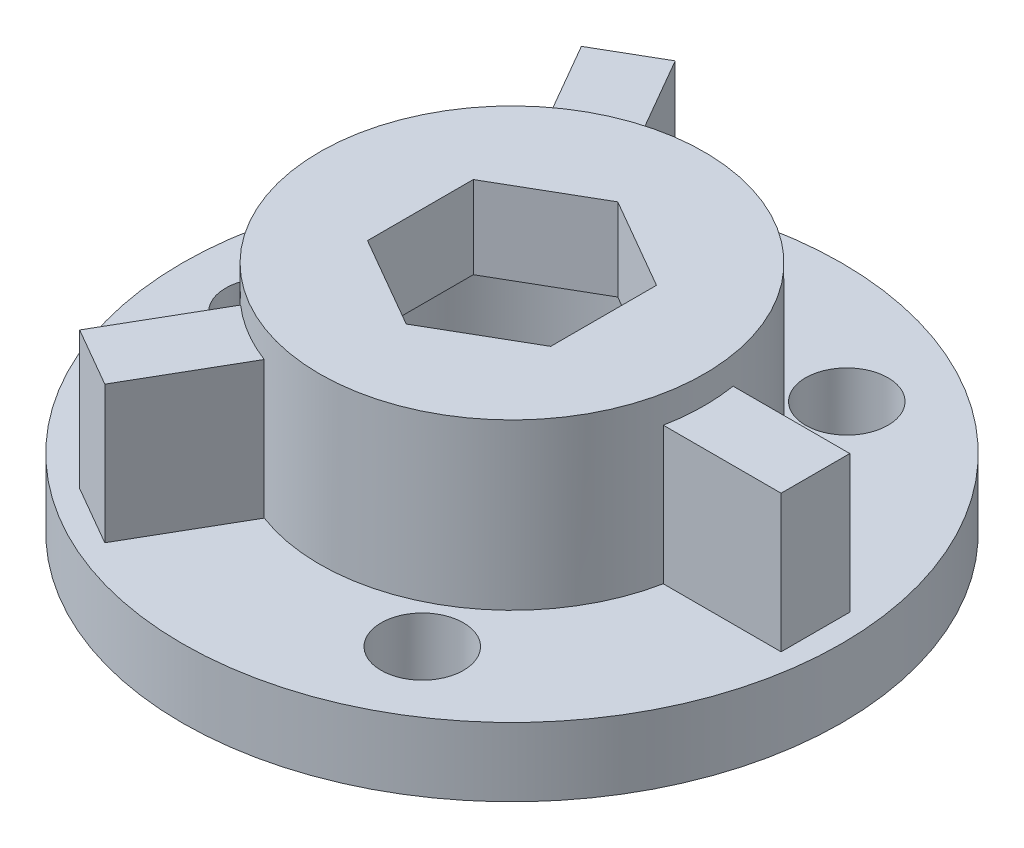
ISO-10303-21;
HEADER;
FILE_DESCRIPTION(('STEP AP214'),'2;1');
FILE_NAME('part.step','',(''),(''),'','','');
FILE_SCHEMA(('AUTOMOTIVE_DESIGN { 1 0 10303 214 1 1 1 1 }'));
ENDSEC;
DATA;
#1=APPLICATION_CONTEXT('core data for automotive mechanical design processes');
#2=APPLICATION_PROTOCOL_DEFINITION('international standard','automotive_design',2000,#1);
#3=PRODUCT_CONTEXT('',#1,'mechanical');
#4=PRODUCT('Part','Part','',(#3));
#5=PRODUCT_RELATED_PRODUCT_CATEGORY('part','',(#4));
#6=PRODUCT_DEFINITION_FORMATION('','',#4);
#7=PRODUCT_DEFINITION_CONTEXT('part definition',#1,'design');
#8=PRODUCT_DEFINITION('design','',#6,#7);
#9=PRODUCT_DEFINITION_SHAPE('','',#8);
#10=(LENGTH_UNIT() NAMED_UNIT(*) SI_UNIT(.MILLI.,.METRE.));
#11=(NAMED_UNIT(*) PLANE_ANGLE_UNIT() SI_UNIT($,.RADIAN.));
#12=(NAMED_UNIT(*) SI_UNIT($,.STERADIAN.) SOLID_ANGLE_UNIT());
#13=UNCERTAINTY_MEASURE_WITH_UNIT(LENGTH_MEASURE(1.E-05),#10,'distance_accuracy_value','');
#14=(GEOMETRIC_REPRESENTATION_CONTEXT(3) GLOBAL_UNCERTAINTY_ASSIGNED_CONTEXT((#13)) GLOBAL_UNIT_ASSIGNED_CONTEXT((#10,
#11,#12)) REPRESENTATION_CONTEXT('',''));
#15=CARTESIAN_POINT('',(0.,0.,0.));
#16=DIRECTION('',(0.,0.,1.));
#17=DIRECTION('',(1.,0.,0.));
#18=AXIS2_PLACEMENT_3D('',#15,#16,#17);
#19=CARTESIAN_POINT('',(0.,2.5,0.));
#20=DIRECTION('',(0.,1.,0.));
#21=DIRECTION('',(0.,0.,1.));
#22=AXIS2_PLACEMENT_3D('',#19,#20,#21);
#23=PLANE('',#22);
#24=CARTESIAN_POINT('',(-8.92,2.5,0.));
#25=DIRECTION('',(0.,1.,0.));
#26=DIRECTION('',(0.,0.,1.));
#27=AXIS2_PLACEMENT_3D('',#24,#25,#26);
#28=CIRCLE('',#27,1.5);
#29=CARTESIAN_POINT('',(-8.92,2.5,1.4999999999999));
#30=VERTEX_POINT('',#29);
#31=EDGE_CURVE('E233',#30,#30,#28,.T.);
#32=ORIENTED_EDGE('',*,*,#31,.F.);
#33=EDGE_LOOP('',(#32));
#34=FACE_BOUND('',#33,.T.);
#35=CARTESIAN_POINT('',(4.45999999999995,2.5,7.72494660175722));
#36=DIRECTION('',(0.,1.,0.));
#37=DIRECTION('',(0.,0.,1.));
#38=AXIS2_PLACEMENT_3D('',#35,#36,#37);
#39=CIRCLE('',#38,1.5);
#40=CARTESIAN_POINT('',(4.45999999999995,2.5,9.22494660175722));
#41=VERTEX_POINT('',#40);
#42=EDGE_CURVE('E239',#41,#41,#39,.T.);
#43=ORIENTED_EDGE('',*,*,#42,.F.);
#44=EDGE_LOOP('',(#43));
#45=FACE_BOUND('',#44,.T.);
#46=CARTESIAN_POINT('',(4.46000000000001,2.5,-7.72494660175719));
#47=DIRECTION('',(0.,1.,0.));
#48=DIRECTION('',(0.,0.,1.));
#49=AXIS2_PLACEMENT_3D('',#46,#47,#48);
#50=CIRCLE('',#49,1.5);
#51=CARTESIAN_POINT('',(4.46000000000001,2.5,-6.22494660175719));
#52=VERTEX_POINT('',#51);
#53=EDGE_CURVE('E245',#52,#52,#50,.T.);
#54=ORIENTED_EDGE('',*,*,#53,.F.);
#55=EDGE_LOOP('',(#54));
#56=FACE_BOUND('',#55,.T.);
#57=CARTESIAN_POINT('',(0.,2.5,0.));
#58=DIRECTION('',(0.,1.,0.));
#59=DIRECTION('',(0.,0.,1.));
#60=AXIS2_PLACEMENT_3D('',#57,#58,#59);
#61=CIRCLE('',#60,12.);
#62=CARTESIAN_POINT('',(0.,2.5,12.));
#63=VERTEX_POINT('',#62);
#64=EDGE_CURVE('E303',#63,#63,#61,.T.);
#65=ORIENTED_EDGE('',*,*,#64,.T.);
#66=EDGE_LOOP('',(#65));
#67=FACE_BOUND('',#66,.T.);
#68=DIRECTION('',(-0.866025403784443,0.,0.499999999999992));
#69=VECTOR('',#68,1.);
#70=CARTESIAN_POINT('',(-6.56442429049857,2.5,-9.09036340646633));
#71=LINE('',#70,#69);
#72=CARTESIAN_POINT('',(-4.39936078103746,2.5,-10.3403634064663));
#73=VERTEX_POINT('',#72);
#74=CARTESIAN_POINT('',(-6.56442429049856,2.5,-9.09036340646633));
#75=VERTEX_POINT('',#74);
#76=EDGE_CURVE('E49',#73,#75,#71,.T.);
#77=ORIENTED_EDGE('',*,*,#76,.F.);
#78=DIRECTION('',(-0.499999999999992,0.,-0.866025403784443));
#79=VECTOR('',#78,1.);
#80=CARTESIAN_POINT('',(-4.39936078103746,2.5,-10.3403634064663));
#81=LINE('',#80,#79);
#82=CARTESIAN_POINT('',(-2.25529719616014,2.5,-6.62673634280044));
#83=VERTEX_POINT('',#82);
#84=EDGE_CURVE('E171',#83,#73,#81,.T.);
#85=ORIENTED_EDGE('',*,*,#84,.F.);
#86=CARTESIAN_POINT('',(0.,2.5,0.));
#87=DIRECTION('',(0.,1.,0.));
#88=DIRECTION('',(0.,0.,1.));
#89=AXIS2_PLACEMENT_3D('',#86,#87,#88);
#90=CIRCLE('',#89,7.);
#91=CARTESIAN_POINT('',(6.90658450644976,2.5,-1.13977649355834));
#92=VERTEX_POINT('',#91);
#93=EDGE_CURVE('E296',#92,#83,#90,.T.);
#94=ORIENTED_EDGE('',*,*,#93,.F.);
#95=DIRECTION('',(-1.,0.,0.));
#96=VECTOR('',#95,1.);
#97=CARTESIAN_POINT('',(11.1546977848816,2.5,-1.13977649355834));
#98=LINE('',#97,#96);
#99=CARTESIAN_POINT('',(11.1546977848816,2.5,-1.13977649355834));
#100=VERTEX_POINT('',#99);
#101=EDGE_CURVE('E212',#100,#92,#98,.T.);
#102=ORIENTED_EDGE('',*,*,#101,.F.);
#103=DIRECTION('',(0.,0.,-1.));
#104=VECTOR('',#103,1.);
#105=CARTESIAN_POINT('',(11.1546977848816,2.5,-1.13977649355834));
#106=LINE('',#105,#104);
#107=CARTESIAN_POINT('',(11.1546977848816,2.5,1.36022350644166));
#108=VERTEX_POINT('',#107);
#109=EDGE_CURVE('E220',#108,#100,#106,.T.);
#110=ORIENTED_EDGE('',*,*,#109,.F.);
#111=DIRECTION('',(1.,0.,0.));
#112=VECTOR('',#111,1.);
#113=CARTESIAN_POINT('',(11.1546977848816,2.5,1.36022350644166));
#114=LINE('',#113,#112);
#115=CARTESIAN_POINT('',(6.86657061512685,2.5,1.36022350644166));
#116=VERTEX_POINT('',#115);
#117=EDGE_CURVE('E208',#116,#108,#114,.T.);
#118=ORIENTED_EDGE('',*,*,#117,.F.);
#119=CARTESIAN_POINT('',(-2.46621685516704,2.5,6.55116588274866));
#120=VERTEX_POINT('',#119);
#121=EDGE_CURVE('E282',#120,#116,#90,.T.);
#122=ORIENTED_EDGE('',*,*,#121,.F.);
#123=DIRECTION('',(0.500000000000004,0.,-0.866025403784436));
#124=VECTOR('',#123,1.);
#125=CARTESIAN_POINT('',(-4.59027349438296,2.5,10.2301399000246));
#126=LINE('',#125,#124);
#127=CARTESIAN_POINT('',(-4.59027349438295,2.5,10.2301399000246));
#128=VERTEX_POINT('',#127);
#129=EDGE_CURVE('E190',#128,#120,#126,.T.);
#130=ORIENTED_EDGE('',*,*,#129,.F.);
#131=DIRECTION('',(0.866025403784436,0.,0.500000000000004));
#132=VECTOR('',#131,1.);
#133=CARTESIAN_POINT('',(-4.59027349438296,2.5,10.2301399000246));
#134=LINE('',#133,#132);
#135=CARTESIAN_POINT('',(-6.75533700384405,2.5,8.98013990002457));
#136=VERTEX_POINT('',#135);
#137=EDGE_CURVE('E198',#136,#128,#134,.T.);
#138=ORIENTED_EDGE('',*,*,#137,.F.);
#139=DIRECTION('',(-0.500000000000004,0.,0.866025403784437));
#140=VECTOR('',#139,1.);
#141=CARTESIAN_POINT('',(-6.75533700384405,2.5,8.98013990002457));
#142=LINE('',#141,#140);
#143=CARTESIAN_POINT('',(-4.61127341896668,2.5,5.26651283635874));
#144=VERTEX_POINT('',#143);
#145=EDGE_CURVE('E173',#144,#136,#142,.T.);
#146=ORIENTED_EDGE('',*,*,#145,.F.);
#147=CARTESIAN_POINT('',(-4.4403676512827,2.5,-5.41138938919037));
#148=VERTEX_POINT('',#147);
#149=EDGE_CURVE('E299',#148,#144,#90,.T.);
#150=ORIENTED_EDGE('',*,*,#149,.F.);
#151=DIRECTION('',(0.499999999999992,0.,0.866025403784443));
#152=VECTOR('',#151,1.);
#153=CARTESIAN_POINT('',(-6.56442429049857,2.5,-9.09036340646633));
#154=LINE('',#153,#152);
#155=EDGE_CURVE('E54',#75,#148,#154,.T.);
#156=ORIENTED_EDGE('',*,*,#155,.F.);
#157=EDGE_LOOP('',(#77,#85,#94,#102,#110,#118,#122,#130,#138,#146,#150,#156));
#158=FACE_BOUND('',#157,.T.);
#159=ADVANCED_FACE('F34',(#34,#45,#56,#67,#158),#23,.T.);
#160=CARTESIAN_POINT('',(0.,8.5,0.));
#161=DIRECTION('',(0.,-1.,0.));
#162=DIRECTION('',(0.,0.,-1.));
#163=AXIS2_PLACEMENT_3D('',#160,#161,#162);
#164=CYLINDRICAL_SURFACE('',#163,7.);
#165=CARTESIAN_POINT('',(0.,8.5,0.));
#166=DIRECTION('',(0.,1.,0.));
#167=DIRECTION('',(0.,0.,1.));
#168=AXIS2_PLACEMENT_3D('',#165,#166,#167);
#169=CIRCLE('',#168,7.);
#170=CARTESIAN_POINT('',(0.,8.5,7.));
#171=VERTEX_POINT('',#170);
#172=EDGE_CURVE('E292',#171,#171,#169,.T.);
#173=ORIENTED_EDGE('',*,*,#172,.F.);
#174=EDGE_LOOP('',(#173));
#175=FACE_BOUND('',#174,.T.);
#176=DIRECTION('',(0.,-1.,0.));
#177=VECTOR('',#176,1.);
#178=CARTESIAN_POINT('',(-2.25529719616014,8.5,-6.62673634280045));
#179=LINE('',#178,#177);
#180=CARTESIAN_POINT('',(-2.25529719616014,7.5,-6.62673634280044));
#181=VERTEX_POINT('',#180);
#182=EDGE_CURVE('E11',#181,#83,#179,.T.);
#183=ORIENTED_EDGE('',*,*,#182,.F.);
#184=CARTESIAN_POINT('',(0.,7.5,0.));
#185=DIRECTION('',(0.,-1.,0.));
#186=DIRECTION('',(0.,0.,-1.));
#187=AXIS2_PLACEMENT_3D('',#184,#185,#186);
#188=CIRCLE('',#187,7.);
#189=CARTESIAN_POINT('',(-4.4403676512827,7.5,-5.41138938919037));
#190=VERTEX_POINT('',#189);
#191=EDGE_CURVE('E165',#190,#181,#188,.T.);
#192=ORIENTED_EDGE('',*,*,#191,.F.);
#193=DIRECTION('',(0.,-1.,0.));
#194=VECTOR('',#193,1.);
#195=CARTESIAN_POINT('',(-4.4403676512827,8.5,-5.41138938919037));
#196=LINE('',#195,#194);
#197=EDGE_CURVE('E42',#148,#190,#196,.F.);
#198=ORIENTED_EDGE('',*,*,#197,.F.);
#199=ORIENTED_EDGE('',*,*,#149,.T.);
#200=DIRECTION('',(0.,-1.,0.));
#201=VECTOR('',#200,1.);
#202=CARTESIAN_POINT('',(-4.61127341896668,8.5,5.26651283635874));
#203=LINE('',#202,#201);
#204=CARTESIAN_POINT('',(-4.61127341896668,7.5,5.26651283635874));
#205=VERTEX_POINT('',#204);
#206=EDGE_CURVE('E325',#205,#144,#203,.T.);
#207=ORIENTED_EDGE('',*,*,#206,.F.);
#208=CARTESIAN_POINT('',(0.,7.5,0.));
#209=DIRECTION('',(0.,-1.,0.));
#210=DIRECTION('',(0.,0.,-1.));
#211=AXIS2_PLACEMENT_3D('',#208,#209,#210);
#212=CIRCLE('',#211,7.);
#213=CARTESIAN_POINT('',(-2.46621685516704,7.5,6.55116588274866));
#214=VERTEX_POINT('',#213);
#215=EDGE_CURVE('E319',#214,#205,#212,.T.);
#216=ORIENTED_EDGE('',*,*,#215,.F.);
#217=DIRECTION('',(0.,-1.,0.));
#218=VECTOR('',#217,1.);
#219=CARTESIAN_POINT('',(-2.46621685516704,8.5,6.55116588274866));
#220=LINE('',#219,#218);
#221=EDGE_CURVE('E322',#120,#214,#220,.F.);
#222=ORIENTED_EDGE('',*,*,#221,.F.);
#223=ORIENTED_EDGE('',*,*,#121,.T.);
#224=DIRECTION('',(0.,-1.,0.));
#225=VECTOR('',#224,1.);
#226=CARTESIAN_POINT('',(6.86657061512685,8.5,1.36022350644166));
#227=LINE('',#226,#225);
#228=CARTESIAN_POINT('',(6.86657061512685,7.5,1.36022350644166));
#229=VERTEX_POINT('',#228);
#230=EDGE_CURVE('E316',#229,#116,#227,.T.);
#231=ORIENTED_EDGE('',*,*,#230,.F.);
#232=CARTESIAN_POINT('',(0.,7.5,0.));
#233=DIRECTION('',(0.,-1.,0.));
#234=DIRECTION('',(0.,0.,-1.));
#235=AXIS2_PLACEMENT_3D('',#232,#233,#234);
#236=CIRCLE('',#235,7.);
#237=CARTESIAN_POINT('',(6.90658450644976,7.5,-1.13977649355834));
#238=VERTEX_POINT('',#237);
#239=EDGE_CURVE('E310',#238,#229,#236,.T.);
#240=ORIENTED_EDGE('',*,*,#239,.F.);
#241=DIRECTION('',(0.,-1.,0.));
#242=VECTOR('',#241,1.);
#243=CARTESIAN_POINT('',(6.90658450644976,8.5,-1.13977649355834));
#244=LINE('',#243,#242);
#245=EDGE_CURVE('E313',#92,#238,#244,.F.);
#246=ORIENTED_EDGE('',*,*,#245,.F.);
#247=ORIENTED_EDGE('',*,*,#93,.T.);
#248=EDGE_LOOP('',(#183,#192,#198,#199,#207,#216,#222,#223,#231,#240,#246,#247));
#249=FACE_BOUND('',#248,.T.);
#250=ADVANCED_FACE('F332',(#175,#249),#164,.T.);
#251=CARTESIAN_POINT('',(0.,0.,3.85));
#252=DIRECTION('',(0.499999999999995,0.,0.866025403784442));
#253=DIRECTION('',(0.866025403784441,0.,-0.499999999999995));
#254=AXIS2_PLACEMENT_3D('',#251,#252,#253);
#255=PLANE('',#254);
#256=DIRECTION('',(0.866025403784441,0.,-0.499999999999995));
#257=VECTOR('',#256,1.);
#258=CARTESIAN_POINT('',(0.,5.5,3.85));
#259=LINE('',#258,#257);
#260=CARTESIAN_POINT('',(0.,5.5,3.85));
#261=VERTEX_POINT('',#260);
#262=CARTESIAN_POINT('',(3.33419780457008,5.5,1.92500000000001));
#263=VERTEX_POINT('',#262);
#264=EDGE_CURVE('E259',#261,#263,#259,.T.);
#265=ORIENTED_EDGE('',*,*,#264,.F.);
#266=DIRECTION('',(0.,1.,0.));
#267=VECTOR('',#266,1.);
#268=CARTESIAN_POINT('',(0.,0.,3.85));
#269=LINE('',#268,#267);
#270=CARTESIAN_POINT('',(0.,8.5,3.85));
#271=VERTEX_POINT('',#270);
#272=EDGE_CURVE('E280',#261,#271,#269,.T.);
#273=ORIENTED_EDGE('',*,*,#272,.T.);
#274=DIRECTION('',(0.866025403784441,0.,-0.499999999999995));
#275=VECTOR('',#274,1.);
#276=CARTESIAN_POINT('',(0.,8.5,3.85));
#277=LINE('',#276,#275);
#278=CARTESIAN_POINT('',(3.33419780457008,8.5,1.92500000000001));
#279=VERTEX_POINT('',#278);
#280=EDGE_CURVE('E261',#271,#279,#277,.T.);
#281=ORIENTED_EDGE('',*,*,#280,.T.);
#282=DIRECTION('',(0.,1.,0.));
#283=VECTOR('',#282,1.);
#284=CARTESIAN_POINT('',(3.33419780457008,0.,1.92500000000001));
#285=LINE('',#284,#283);
#286=EDGE_CURVE('E279',#263,#279,#285,.T.);
#287=ORIENTED_EDGE('',*,*,#286,.F.);
#288=EDGE_LOOP('',(#265,#273,#281,#287));
#289=FACE_BOUND('',#288,.T.);
#290=ADVANCED_FACE('F369',(#289),#255,.F.);
#291=CARTESIAN_POINT('',(-3.33419780457011,0.,1.92499999999996));
#292=DIRECTION('',(-0.500000000000009,0.,0.866025403784434));
#293=DIRECTION('',(0.866025403784433,0.,0.500000000000009));
#294=AXIS2_PLACEMENT_3D('',#291,#292,#293);
#295=PLANE('',#294);
#296=DIRECTION('',(0.866025403784433,0.,0.500000000000009));
#297=VECTOR('',#296,1.);
#298=CARTESIAN_POINT('',(-3.33419780457011,5.5,1.92499999999996));
#299=LINE('',#298,#297);
#300=CARTESIAN_POINT('',(-3.33419780457011,5.5,1.92499999999996));
#301=VERTEX_POINT('',#300);
#302=EDGE_CURVE('E257',#301,#261,#299,.T.);
#303=ORIENTED_EDGE('',*,*,#302,.F.);
#304=DIRECTION('',(0.,1.,0.));
#305=VECTOR('',#304,1.);
#306=CARTESIAN_POINT('',(-3.33419780457011,0.,1.92499999999996));
#307=LINE('',#306,#305);
#308=CARTESIAN_POINT('',(-3.33419780457011,8.5,1.92499999999996));
#309=VERTEX_POINT('',#308);
#310=EDGE_CURVE('E283',#301,#309,#307,.T.);
#311=ORIENTED_EDGE('',*,*,#310,.T.);
#312=DIRECTION('',(0.866025403784433,0.,0.500000000000009));
#313=VECTOR('',#312,1.);
#314=CARTESIAN_POINT('',(-3.33419780457011,8.5,1.92499999999996));
#315=LINE('',#314,#313);
#316=EDGE_CURVE('E276',#309,#271,#315,.T.);
#317=ORIENTED_EDGE('',*,*,#316,.T.);
#318=ORIENTED_EDGE('',*,*,#272,.F.);
#319=EDGE_LOOP('',(#303,#311,#317,#318));
#320=FACE_BOUND('',#319,.T.);
#321=ADVANCED_FACE('F434',(#320),#295,.F.);
#322=CARTESIAN_POINT('',(-3.33419780457007,0.,-1.92500000000003));
#323=DIRECTION('',(-1.,0.,0.));
#324=DIRECTION('',(0.,0.,1.));
#325=AXIS2_PLACEMENT_3D('',#322,#323,#324);
#326=PLANE('',#325);
#327=DIRECTION('',(0.,0.,1.));
#328=VECTOR('',#327,1.);
#329=CARTESIAN_POINT('',(-3.33419780457007,5.5,-1.92500000000003));
#330=LINE('',#329,#328);
#331=CARTESIAN_POINT('',(-3.33419780457007,5.5,-1.92500000000003));
#332=VERTEX_POINT('',#331);
#333=EDGE_CURVE('E255',#332,#301,#330,.T.);
#334=ORIENTED_EDGE('',*,*,#333,.F.);
#335=DIRECTION('',(0.,1.,0.));
#336=VECTOR('',#335,1.);
#337=CARTESIAN_POINT('',(-3.33419780457007,0.,-1.92500000000003));
#338=LINE('',#337,#336);
#339=CARTESIAN_POINT('',(-3.33419780457007,8.5,-1.92500000000003));
#340=VERTEX_POINT('',#339);
#341=EDGE_CURVE('E285',#332,#340,#338,.T.);
#342=ORIENTED_EDGE('',*,*,#341,.T.);
#343=DIRECTION('',(0.,0.,1.));
#344=VECTOR('',#343,1.);
#345=CARTESIAN_POINT('',(-3.33419780457007,8.5,-1.92500000000003));
#346=LINE('',#345,#344);
#347=EDGE_CURVE('E273',#340,#309,#346,.T.);
#348=ORIENTED_EDGE('',*,*,#347,.T.);
#349=ORIENTED_EDGE('',*,*,#310,.F.);
#350=EDGE_LOOP('',(#334,#342,#348,#349));
#351=FACE_BOUND('',#350,.T.);
#352=ADVANCED_FACE('F431',(#351),#326,.F.);
#353=CARTESIAN_POINT('',(-3.33419780457007,0.,-1.92500000000003));
#354=DIRECTION('',(-0.499999999999994,0.,-0.866025403784442));
#355=DIRECTION('',(-0.866025403784442,0.,0.499999999999994));
#356=AXIS2_PLACEMENT_3D('',#353,#354,#355);
#357=PLANE('',#356);
#358=DIRECTION('',(-0.866025403784442,0.,0.499999999999994));
#359=VECTOR('',#358,1.);
#360=CARTESIAN_POINT('',(-3.33419780457007,5.5,-1.92500000000003));
#361=LINE('',#360,#359);
#362=CARTESIAN_POINT('',(0.,5.5,-3.85));
#363=VERTEX_POINT('',#362);
#364=EDGE_CURVE('E253',#363,#332,#361,.T.);
#365=ORIENTED_EDGE('',*,*,#364,.F.);
#366=DIRECTION('',(0.,1.,0.));
#367=VECTOR('',#366,1.);
#368=CARTESIAN_POINT('',(0.,0.,-3.85));
#369=LINE('',#368,#367);
#370=CARTESIAN_POINT('',(0.,8.5,-3.85));
#371=VERTEX_POINT('',#370);
#372=EDGE_CURVE('E287',#363,#371,#369,.T.);
#373=ORIENTED_EDGE('',*,*,#372,.T.);
#374=DIRECTION('',(-0.866025403784442,0.,0.499999999999994));
#375=VECTOR('',#374,1.);
#376=CARTESIAN_POINT('',(-3.33419780457007,8.5,-1.92500000000003));
#377=LINE('',#376,#375);
#378=EDGE_CURVE('E270',#371,#340,#377,.T.);
#379=ORIENTED_EDGE('',*,*,#378,.T.);
#380=ORIENTED_EDGE('',*,*,#341,.F.);
#381=EDGE_LOOP('',(#365,#373,#379,#380));
#382=FACE_BOUND('',#381,.T.);
#383=ADVANCED_FACE('F429',(#382),#357,.F.);
#384=CARTESIAN_POINT('',(0.,0.,-3.85));
#385=DIRECTION('',(0.500000000000011,0.,-0.866025403784433));
#386=DIRECTION('',(-0.866025403784432,0.,-0.500000000000011));
#387=AXIS2_PLACEMENT_3D('',#384,#385,#386);
#388=PLANE('',#387);
#389=DIRECTION('',(-0.866025403784432,0.,-0.500000000000011));
#390=VECTOR('',#389,1.);
#391=CARTESIAN_POINT('',(0.,5.5,-3.85));
#392=LINE('',#391,#390);
#393=CARTESIAN_POINT('',(3.33419780457002,5.5,-1.92499999999999));
#394=VERTEX_POINT('',#393);
#395=EDGE_CURVE('E251',#394,#363,#392,.T.);
#396=ORIENTED_EDGE('',*,*,#395,.F.);
#397=DIRECTION('',(0.,1.,0.));
#398=VECTOR('',#397,1.);
#399=CARTESIAN_POINT('',(3.33419780457002,0.,-1.92499999999999));
#400=LINE('',#399,#398);
#401=CARTESIAN_POINT('',(3.33419780457002,8.5,-1.92499999999999));
#402=VERTEX_POINT('',#401);
#403=EDGE_CURVE('E289',#394,#402,#400,.T.);
#404=ORIENTED_EDGE('',*,*,#403,.T.);
#405=DIRECTION('',(-0.866025403784432,0.,-0.500000000000011));
#406=VECTOR('',#405,1.);
#407=CARTESIAN_POINT('',(0.,8.5,-3.85));
#408=LINE('',#407,#406);
#409=EDGE_CURVE('E267',#402,#371,#408,.T.);
#410=ORIENTED_EDGE('',*,*,#409,.T.);
#411=ORIENTED_EDGE('',*,*,#372,.F.);
#412=EDGE_LOOP('',(#396,#404,#410,#411));
#413=FACE_BOUND('',#412,.T.);
#414=ADVANCED_FACE('F424',(#413),#388,.F.);
#415=CARTESIAN_POINT('',(3.33419780457008,0.,1.92500000000001));
#416=DIRECTION('',(1.,0.,0.));
#417=DIRECTION('',(0.,0.,-1.));
#418=AXIS2_PLACEMENT_3D('',#415,#416,#417);
#419=PLANE('',#418);
#420=DIRECTION('',(0.,0.,-1.));
#421=VECTOR('',#420,1.);
#422=CARTESIAN_POINT('',(3.33419780457008,5.5,1.92500000000001));
#423=LINE('',#422,#421);
#424=EDGE_CURVE('E306',#263,#394,#423,.T.);
#425=ORIENTED_EDGE('',*,*,#424,.F.);
#426=ORIENTED_EDGE('',*,*,#286,.T.);
#427=DIRECTION('',(0.,0.,-1.));
#428=VECTOR('',#427,1.);
#429=CARTESIAN_POINT('',(3.33419780457008,8.5,1.92500000000001));
#430=LINE('',#429,#428);
#431=EDGE_CURVE('E264',#279,#402,#430,.T.);
#432=ORIENTED_EDGE('',*,*,#431,.T.);
#433=ORIENTED_EDGE('',*,*,#403,.F.);
#434=EDGE_LOOP('',(#425,#426,#432,#433));
#435=FACE_BOUND('',#434,.T.);
#436=ADVANCED_FACE('F385',(#435),#419,.F.);
#437=CARTESIAN_POINT('',(0.,2.5,0.));
#438=DIRECTION('',(0.,-1.,0.));
#439=DIRECTION('',(0.,0.,-1.));
#440=AXIS2_PLACEMENT_3D('',#437,#438,#439);
#441=CYLINDRICAL_SURFACE('',#440,12.);
#442=ORIENTED_EDGE('',*,*,#64,.F.);
#443=EDGE_LOOP('',(#442));
#444=FACE_BOUND('',#443,.T.);
#445=CARTESIAN_POINT('',(0.,0.,0.));
#446=DIRECTION('',(0.,1.,0.));
#447=DIRECTION('',(0.,0.,1.));
#448=AXIS2_PLACEMENT_3D('',#445,#446,#447);
#449=CIRCLE('',#448,12.);
#450=CARTESIAN_POINT('',(0.,0.,12.));
#451=VERTEX_POINT('',#450);
#452=EDGE_CURVE('E302',#451,#451,#449,.T.);
#453=ORIENTED_EDGE('',*,*,#452,.T.);
#454=EDGE_LOOP('',(#453));
#455=FACE_BOUND('',#454,.T.);
#456=ADVANCED_FACE('F36',(#444,#455),#441,.T.);
#457=CARTESIAN_POINT('',(0.,0.,0.));
#458=DIRECTION('',(0.,1.,0.));
#459=DIRECTION('',(0.,0.,1.));
#460=AXIS2_PLACEMENT_3D('',#457,#458,#459);
#461=PLANE('',#460);
#462=CARTESIAN_POINT('',(-8.92,0.,0.));
#463=DIRECTION('',(0.,-1.,0.));
#464=DIRECTION('',(-0.866025403784443,0.,0.499999999999992));
#465=AXIS2_PLACEMENT_3D('',#462,#463,#464);
#466=CIRCLE('',#465,1.5);
#467=CARTESIAN_POINT('',(-10.2190381056767,0.,0.749999999999892));
#468=VERTEX_POINT('',#467);
#469=EDGE_CURVE('E230',#468,#468,#466,.T.);
#470=ORIENTED_EDGE('',*,*,#469,.F.);
#471=EDGE_LOOP('',(#470));
#472=FACE_BOUND('',#471,.T.);
#473=CARTESIAN_POINT('',(4.45999999999995,0.,7.72494660175722));
#474=DIRECTION('',(0.,-1.,0.));
#475=DIRECTION('',(0.866025403784436,0.,0.500000000000004));
#476=AXIS2_PLACEMENT_3D('',#473,#474,#475);
#477=CIRCLE('',#476,1.5);
#478=CARTESIAN_POINT('',(5.75903810567661,0.,8.47494660175723));
#479=VERTEX_POINT('',#478);
#480=EDGE_CURVE('E236',#479,#479,#477,.T.);
#481=ORIENTED_EDGE('',*,*,#480,.F.);
#482=EDGE_LOOP('',(#481));
#483=FACE_BOUND('',#482,.T.);
#484=CARTESIAN_POINT('',(4.46000000000001,0.,-7.72494660175719));
#485=DIRECTION('',(0.,-1.,0.));
#486=DIRECTION('',(0.,0.,-1.));
#487=AXIS2_PLACEMENT_3D('',#484,#485,#486);
#488=CIRCLE('',#487,1.5);
#489=CARTESIAN_POINT('',(4.46000000000001,0.,-9.22494660175719));
#490=VERTEX_POINT('',#489);
#491=EDGE_CURVE('E242',#490,#490,#488,.T.);
#492=ORIENTED_EDGE('',*,*,#491,.F.);
#493=EDGE_LOOP('',(#492));
#494=FACE_BOUND('',#493,.T.);
#495=CARTESIAN_POINT('',(0.,0.,0.));
#496=DIRECTION('',(0.,1.,0.));
#497=DIRECTION('',(0.,0.,1.));
#498=AXIS2_PLACEMENT_3D('',#495,#496,#497);
#499=CIRCLE('',#498,5.7);
#500=CARTESIAN_POINT('',(0.,0.,5.7));
#501=VERTEX_POINT('',#500);
#502=EDGE_CURVE('E295',#501,#501,#499,.T.);
#503=ORIENTED_EDGE('',*,*,#502,.T.);
#504=EDGE_LOOP('',(#503));
#505=FACE_BOUND('',#504,.T.);
#506=ORIENTED_EDGE('',*,*,#452,.F.);
#507=EDGE_LOOP('',(#506));
#508=FACE_BOUND('',#507,.T.);
#509=ADVANCED_FACE('F376',(#472,#483,#494,#505,#508),#461,.F.);
#510=CARTESIAN_POINT('',(0.,0.,0.));
#511=DIRECTION('',(0.,1.,0.));
#512=DIRECTION('',(0.,0.,1.));
#513=AXIS2_PLACEMENT_3D('',#510,#511,#512);
#514=CYLINDRICAL_SURFACE('',#513,5.7);
#515=ORIENTED_EDGE('',*,*,#502,.F.);
#516=EDGE_LOOP('',(#515));
#517=FACE_BOUND('',#516,.T.);
#518=CARTESIAN_POINT('',(0.,5.5,0.));
#519=DIRECTION('',(0.,-1.,0.));
#520=DIRECTION('',(0.,0.,-1.));
#521=AXIS2_PLACEMENT_3D('',#518,#519,#520);
#522=CIRCLE('',#521,5.7);
#523=CARTESIAN_POINT('',(0.,5.5,-5.7));
#524=VERTEX_POINT('',#523);
#525=EDGE_CURVE('E248',#524,#524,#522,.T.);
#526=ORIENTED_EDGE('',*,*,#525,.F.);
#527=EDGE_LOOP('',(#526));
#528=FACE_BOUND('',#527,.T.);
#529=ADVANCED_FACE('F375',(#517,#528),#514,.F.);
#530=CARTESIAN_POINT('',(0.,8.5,0.));
#531=DIRECTION('',(0.,1.,0.));
#532=DIRECTION('',(0.,0.,1.));
#533=AXIS2_PLACEMENT_3D('',#530,#531,#532);
#534=PLANE('',#533);
#535=ORIENTED_EDGE('',*,*,#280,.F.);
#536=ORIENTED_EDGE('',*,*,#316,.F.);
#537=ORIENTED_EDGE('',*,*,#347,.F.);
#538=ORIENTED_EDGE('',*,*,#378,.F.);
#539=ORIENTED_EDGE('',*,*,#409,.F.);
#540=ORIENTED_EDGE('',*,*,#431,.F.);
#541=EDGE_LOOP('',(#535,#536,#537,#538,#539,#540));
#542=FACE_BOUND('',#541,.T.);
#543=ORIENTED_EDGE('',*,*,#172,.T.);
#544=EDGE_LOOP('',(#543));
#545=FACE_BOUND('',#544,.T.);
#546=ADVANCED_FACE('F383',(#542,#545),#534,.T.);
#547=CARTESIAN_POINT('',(0.,5.5,0.));
#548=DIRECTION('',(0.,-1.,0.));
#549=DIRECTION('',(0.,0.,-1.));
#550=AXIS2_PLACEMENT_3D('',#547,#548,#549);
#551=PLANE('',#550);
#552=ORIENTED_EDGE('',*,*,#525,.T.);
#553=EDGE_LOOP('',(#552));
#554=FACE_BOUND('',#553,.T.);
#555=ORIENTED_EDGE('',*,*,#264,.T.);
#556=ORIENTED_EDGE('',*,*,#424,.T.);
#557=ORIENTED_EDGE('',*,*,#395,.T.);
#558=ORIENTED_EDGE('',*,*,#364,.T.);
#559=ORIENTED_EDGE('',*,*,#333,.T.);
#560=ORIENTED_EDGE('',*,*,#302,.T.);
#561=EDGE_LOOP('',(#555,#556,#557,#558,#559,#560));
#562=FACE_BOUND('',#561,.T.);
#563=ADVANCED_FACE('F400',(#554,#562),#551,.T.);
#564=CARTESIAN_POINT('',(4.46000000000001,8.5,-7.72494660175719));
#565=DIRECTION('',(0.,-1.,0.));
#566=DIRECTION('',(0.,0.,-1.));
#567=AXIS2_PLACEMENT_3D('',#564,#565,#566);
#568=CYLINDRICAL_SURFACE('',#567,1.5);
#569=ORIENTED_EDGE('',*,*,#53,.T.);
#570=EDGE_LOOP('',(#569));
#571=FACE_BOUND('',#570,.T.);
#572=ORIENTED_EDGE('',*,*,#491,.T.);
#573=EDGE_LOOP('',(#572));
#574=FACE_BOUND('',#573,.T.);
#575=ADVANCED_FACE('F403',(#571,#574),#568,.F.);
#576=CARTESIAN_POINT('',(4.45999999999995,8.5,7.72494660175722));
#577=DIRECTION('',(0.,-1.,0.));
#578=DIRECTION('',(0.,0.,-1.));
#579=AXIS2_PLACEMENT_3D('',#576,#577,#578);
#580=CYLINDRICAL_SURFACE('',#579,1.5);
#581=ORIENTED_EDGE('',*,*,#42,.T.);
#582=EDGE_LOOP('',(#581));
#583=FACE_BOUND('',#582,.T.);
#584=ORIENTED_EDGE('',*,*,#480,.T.);
#585=EDGE_LOOP('',(#584));
#586=FACE_BOUND('',#585,.T.);
#587=ADVANCED_FACE('F468',(#583,#586),#580,.F.);
#588=CARTESIAN_POINT('',(-8.92,8.5,0.));
#589=DIRECTION('',(0.,-1.,0.));
#590=DIRECTION('',(0.,0.,-1.));
#591=AXIS2_PLACEMENT_3D('',#588,#589,#590);
#592=CYLINDRICAL_SURFACE('',#591,1.5);
#593=ORIENTED_EDGE('',*,*,#31,.T.);
#594=EDGE_LOOP('',(#593));
#595=FACE_BOUND('',#594,.T.);
#596=ORIENTED_EDGE('',*,*,#469,.T.);
#597=EDGE_LOOP('',(#596));
#598=FACE_BOUND('',#597,.T.);
#599=ADVANCED_FACE('F475',(#595,#598),#592,.F.);
#600=CARTESIAN_POINT('',(11.1546977848816,7.5,1.36022350644166));
#601=DIRECTION('',(0.,0.,-1.));
#602=DIRECTION('',(-1.,0.,0.));
#603=AXIS2_PLACEMENT_3D('',#600,#601,#602);
#604=PLANE('',#603);
#605=DIRECTION('',(1.,0.,0.));
#606=VECTOR('',#605,1.);
#607=CARTESIAN_POINT('',(11.1546977848816,7.5,1.36022350644166));
#608=LINE('',#607,#606);
#609=CARTESIAN_POINT('',(11.1546977848816,7.5,1.36022350644166));
#610=VERTEX_POINT('',#609);
#611=EDGE_CURVE('E209',#229,#610,#608,.T.);
#612=ORIENTED_EDGE('',*,*,#611,.F.);
#613=ORIENTED_EDGE('',*,*,#230,.T.);
#614=ORIENTED_EDGE('',*,*,#117,.T.);
#615=DIRECTION('',(0.,-1.,0.));
#616=VECTOR('',#615,1.);
#617=CARTESIAN_POINT('',(11.1546977848816,7.5,1.36022350644166));
#618=LINE('',#617,#616);
#619=EDGE_CURVE('E227',#610,#108,#618,.T.);
#620=ORIENTED_EDGE('',*,*,#619,.F.);
#621=EDGE_LOOP('',(#612,#613,#614,#620));
#622=FACE_BOUND('',#621,.T.);
#623=ADVANCED_FACE('F339',(#622),#604,.F.);
#624=CARTESIAN_POINT('',(11.1546977848816,7.5,-1.13977649355834));
#625=DIRECTION('',(0.,0.,1.));
#626=DIRECTION('',(1.,0.,0.));
#627=AXIS2_PLACEMENT_3D('',#624,#625,#626);
#628=PLANE('',#627);
#629=ORIENTED_EDGE('',*,*,#101,.T.);
#630=ORIENTED_EDGE('',*,*,#245,.T.);
#631=DIRECTION('',(-1.,0.,0.));
#632=VECTOR('',#631,1.);
#633=CARTESIAN_POINT('',(11.1546977848816,7.5,-1.13977649355834));
#634=LINE('',#633,#632);
#635=CARTESIAN_POINT('',(11.1546977848816,7.5,-1.13977649355834));
#636=VERTEX_POINT('',#635);
#637=EDGE_CURVE('E214',#636,#238,#634,.T.);
#638=ORIENTED_EDGE('',*,*,#637,.F.);
#639=DIRECTION('',(0.,-1.,0.));
#640=VECTOR('',#639,1.);
#641=CARTESIAN_POINT('',(11.1546977848816,7.5,-1.13977649355834));
#642=LINE('',#641,#640);
#643=EDGE_CURVE('E217',#636,#100,#642,.T.);
#644=ORIENTED_EDGE('',*,*,#643,.T.);
#645=EDGE_LOOP('',(#629,#630,#638,#644));
#646=FACE_BOUND('',#645,.T.);
#647=ADVANCED_FACE('F347',(#646),#628,.F.);
#648=CARTESIAN_POINT('',(0.,7.5,0.));
#649=DIRECTION('',(0.,-1.,0.));
#650=DIRECTION('',(0.,0.,-1.));
#651=AXIS2_PLACEMENT_3D('',#648,#649,#650);
#652=PLANE('',#651);
#653=ORIENTED_EDGE('',*,*,#637,.T.);
#654=ORIENTED_EDGE('',*,*,#239,.T.);
#655=ORIENTED_EDGE('',*,*,#611,.T.);
#656=DIRECTION('',(0.,0.,-1.));
#657=VECTOR('',#656,1.);
#658=CARTESIAN_POINT('',(11.1546977848816,7.5,-1.13977649355834));
#659=LINE('',#658,#657);
#660=EDGE_CURVE('E211',#610,#636,#659,.T.);
#661=ORIENTED_EDGE('',*,*,#660,.T.);
#662=EDGE_LOOP('',(#653,#654,#655,#661));
#663=FACE_BOUND('',#662,.T.);
#664=ADVANCED_FACE('F342',(#663),#652,.F.);
#665=CARTESIAN_POINT('',(11.1546977848816,7.5,-1.13977649355834));
#666=DIRECTION('',(-1.,0.,0.));
#667=DIRECTION('',(0.,0.,1.));
#668=AXIS2_PLACEMENT_3D('',#665,#666,#667);
#669=PLANE('',#668);
#670=ORIENTED_EDGE('',*,*,#109,.T.);
#671=ORIENTED_EDGE('',*,*,#643,.F.);
#672=ORIENTED_EDGE('',*,*,#660,.F.);
#673=ORIENTED_EDGE('',*,*,#619,.T.);
#674=EDGE_LOOP('',(#670,#671,#672,#673));
#675=FACE_BOUND('',#674,.T.);
#676=ADVANCED_FACE('F349',(#675),#669,.F.);
#677=CARTESIAN_POINT('',(-6.75533700384405,7.5,8.98013990002457));
#678=DIRECTION('',(0.866025403784436,0.,0.500000000000004));
#679=DIRECTION('',(0.500000000000004,0.,-0.866025403784436));
#680=AXIS2_PLACEMENT_3D('',#677,#678,#679);
#681=PLANE('',#680);
#682=DIRECTION('',(-0.500000000000004,0.,0.866025403784437));
#683=VECTOR('',#682,1.);
#684=CARTESIAN_POINT('',(-6.75533700384405,7.5,8.98013990002457));
#685=LINE('',#684,#683);
#686=CARTESIAN_POINT('',(-6.75533700384405,7.5,8.98013990002457));
#687=VERTEX_POINT('',#686);
#688=EDGE_CURVE('E187',#205,#687,#685,.T.);
#689=ORIENTED_EDGE('',*,*,#688,.F.);
#690=ORIENTED_EDGE('',*,*,#206,.T.);
#691=ORIENTED_EDGE('',*,*,#145,.T.);
#692=DIRECTION('',(0.,-1.,0.));
#693=VECTOR('',#692,1.);
#694=CARTESIAN_POINT('',(-6.75533700384405,7.5,8.98013990002457));
#695=LINE('',#694,#693);
#696=EDGE_CURVE('E205',#687,#136,#695,.T.);
#697=ORIENTED_EDGE('',*,*,#696,.F.);
#698=EDGE_LOOP('',(#689,#690,#691,#697));
#699=FACE_BOUND('',#698,.T.);
#700=ADVANCED_FACE('F351',(#699),#681,.F.);
#701=CARTESIAN_POINT('',(-4.59027349438296,7.5,10.2301399000246));
#702=DIRECTION('',(-0.866025403784436,0.,-0.500000000000004));
#703=DIRECTION('',(-0.500000000000004,0.,0.866025403784436));
#704=AXIS2_PLACEMENT_3D('',#701,#702,#703);
#705=PLANE('',#704);
#706=ORIENTED_EDGE('',*,*,#129,.T.);
#707=ORIENTED_EDGE('',*,*,#221,.T.);
#708=DIRECTION('',(0.500000000000004,0.,-0.866025403784436));
#709=VECTOR('',#708,1.);
#710=CARTESIAN_POINT('',(-4.59027349438296,7.5,10.2301399000246));
#711=LINE('',#710,#709);
#712=CARTESIAN_POINT('',(-4.59027349438296,7.5,10.2301399000246));
#713=VERTEX_POINT('',#712);
#714=EDGE_CURVE('E192',#713,#214,#711,.T.);
#715=ORIENTED_EDGE('',*,*,#714,.F.);
#716=DIRECTION('',(0.,-1.,0.));
#717=VECTOR('',#716,1.);
#718=CARTESIAN_POINT('',(-4.59027349438296,7.5,10.2301399000246));
#719=LINE('',#718,#717);
#720=EDGE_CURVE('E195',#713,#128,#719,.T.);
#721=ORIENTED_EDGE('',*,*,#720,.T.);
#722=EDGE_LOOP('',(#706,#707,#715,#721));
#723=FACE_BOUND('',#722,.T.);
#724=ADVANCED_FACE('F357',(#723),#705,.F.);
#725=CARTESIAN_POINT('',(0.,7.5,0.));
#726=DIRECTION('',(0.,-1.,0.));
#727=DIRECTION('',(0.866025403784436,0.,0.500000000000004));
#728=AXIS2_PLACEMENT_3D('',#725,#726,#727);
#729=PLANE('',#728);
#730=ORIENTED_EDGE('',*,*,#714,.T.);
#731=ORIENTED_EDGE('',*,*,#215,.T.);
#732=ORIENTED_EDGE('',*,*,#688,.T.);
#733=DIRECTION('',(0.866025403784436,0.,0.500000000000004));
#734=VECTOR('',#733,1.);
#735=CARTESIAN_POINT('',(-4.59027349438296,7.5,10.2301399000246));
#736=LINE('',#735,#734);
#737=EDGE_CURVE('E189',#687,#713,#736,.T.);
#738=ORIENTED_EDGE('',*,*,#737,.T.);
#739=EDGE_LOOP('',(#730,#731,#732,#738));
#740=FACE_BOUND('',#739,.T.);
#741=ADVANCED_FACE('F527',(#740),#729,.F.);
#742=CARTESIAN_POINT('',(-4.59027349438296,7.5,10.2301399000246));
#743=DIRECTION('',(0.500000000000004,0.,-0.866025403784436));
#744=DIRECTION('',(-0.866025403784436,0.,-0.500000000000004));
#745=AXIS2_PLACEMENT_3D('',#742,#743,#744);
#746=PLANE('',#745);
#747=ORIENTED_EDGE('',*,*,#137,.T.);
#748=ORIENTED_EDGE('',*,*,#720,.F.);
#749=ORIENTED_EDGE('',*,*,#737,.F.);
#750=ORIENTED_EDGE('',*,*,#696,.T.);
#751=EDGE_LOOP('',(#747,#748,#749,#750));
#752=FACE_BOUND('',#751,.T.);
#753=ADVANCED_FACE('F537',(#752),#746,.F.);
#754=CARTESIAN_POINT('',(-4.39936078103746,7.5,-10.3403634064663));
#755=DIRECTION('',(-0.866025403784443,0.,0.499999999999992));
#756=DIRECTION('',(0.499999999999992,0.,0.866025403784443));
#757=AXIS2_PLACEMENT_3D('',#754,#755,#756);
#758=PLANE('',#757);
#759=DIRECTION('',(-0.499999999999992,0.,-0.866025403784443));
#760=VECTOR('',#759,1.);
#761=CARTESIAN_POINT('',(-4.39936078103746,7.5,-10.3403634064663));
#762=LINE('',#761,#760);
#763=CARTESIAN_POINT('',(-4.39936078103746,7.5,-10.3403634064663));
#764=VERTEX_POINT('',#763);
#765=EDGE_CURVE('E158',#181,#764,#762,.T.);
#766=ORIENTED_EDGE('',*,*,#765,.F.);
#767=ORIENTED_EDGE('',*,*,#182,.T.);
#768=ORIENTED_EDGE('',*,*,#84,.T.);
#769=DIRECTION('',(0.,-1.,0.));
#770=VECTOR('',#769,1.);
#771=CARTESIAN_POINT('',(-4.39936078103746,7.5,-10.3403634064663));
#772=LINE('',#771,#770);
#773=EDGE_CURVE('E169',#764,#73,#772,.T.);
#774=ORIENTED_EDGE('',*,*,#773,.F.);
#775=EDGE_LOOP('',(#766,#767,#768,#774));
#776=FACE_BOUND('',#775,.T.);
#777=ADVANCED_FACE('F170',(#776),#758,.F.);
#778=CARTESIAN_POINT('',(-6.56442429049857,7.5,-9.09036340646633));
#779=DIRECTION('',(0.866025403784443,0.,-0.499999999999992));
#780=DIRECTION('',(-0.499999999999992,0.,-0.866025403784443));
#781=AXIS2_PLACEMENT_3D('',#778,#779,#780);
#782=PLANE('',#781);
#783=ORIENTED_EDGE('',*,*,#155,.T.);
#784=ORIENTED_EDGE('',*,*,#197,.T.);
#785=DIRECTION('',(0.499999999999992,0.,0.866025403784443));
#786=VECTOR('',#785,1.);
#787=CARTESIAN_POINT('',(-6.56442429049857,7.5,-9.09036340646633));
#788=LINE('',#787,#786);
#789=CARTESIAN_POINT('',(-6.56442429049857,7.5,-9.09036340646633));
#790=VERTEX_POINT('',#789);
#791=EDGE_CURVE('E179',#790,#190,#788,.T.);
#792=ORIENTED_EDGE('',*,*,#791,.F.);
#793=DIRECTION('',(0.,-1.,0.));
#794=VECTOR('',#793,1.);
#795=CARTESIAN_POINT('',(-6.56442429049857,7.5,-9.09036340646633));
#796=LINE('',#795,#794);
#797=EDGE_CURVE('E174',#790,#75,#796,.T.);
#798=ORIENTED_EDGE('',*,*,#797,.T.);
#799=EDGE_LOOP('',(#783,#784,#792,#798));
#800=FACE_BOUND('',#799,.T.);
#801=ADVANCED_FACE('F330',(#800),#782,.F.);
#802=CARTESIAN_POINT('',(0.,7.5,0.));
#803=DIRECTION('',(0.,-1.,0.));
#804=DIRECTION('',(-0.866025403784443,0.,0.499999999999992));
#805=AXIS2_PLACEMENT_3D('',#802,#803,#804);
#806=PLANE('',#805);
#807=ORIENTED_EDGE('',*,*,#791,.T.);
#808=ORIENTED_EDGE('',*,*,#191,.T.);
#809=ORIENTED_EDGE('',*,*,#765,.T.);
#810=DIRECTION('',(-0.866025403784443,0.,0.499999999999992));
#811=VECTOR('',#810,1.);
#812=CARTESIAN_POINT('',(-6.56442429049857,7.5,-9.09036340646633));
#813=LINE('',#812,#811);
#814=EDGE_CURVE('E163',#764,#790,#813,.T.);
#815=ORIENTED_EDGE('',*,*,#814,.T.);
#816=EDGE_LOOP('',(#807,#808,#809,#815));
#817=FACE_BOUND('',#816,.T.);
#818=ADVANCED_FACE('F161',(#817),#806,.F.);
#819=CARTESIAN_POINT('',(-6.56442429049857,7.5,-9.09036340646633));
#820=DIRECTION('',(0.499999999999992,0.,0.866025403784443));
#821=DIRECTION('',(0.866025403784443,0.,-0.499999999999992));
#822=AXIS2_PLACEMENT_3D('',#819,#820,#821);
#823=PLANE('',#822);
#824=ORIENTED_EDGE('',*,*,#76,.T.);
#825=ORIENTED_EDGE('',*,*,#797,.F.);
#826=ORIENTED_EDGE('',*,*,#814,.F.);
#827=ORIENTED_EDGE('',*,*,#773,.T.);
#828=EDGE_LOOP('',(#824,#825,#826,#827));
#829=FACE_BOUND('',#828,.T.);
#830=ADVANCED_FACE('F176',(#829),#823,.F.);
#831=CLOSED_SHELL('',(#159,#250,#290,#321,#352,#383,#414,#436,#456,#509,#529,#546,#563,#575,
#587,#599,#623,#647,#664,#676,#700,#724,#741,#753,#777,#801,#818,#830));
#832=MANIFOLD_SOLID_BREP('B2',#831);
#833=ADVANCED_BREP_SHAPE_REPRESENTATION('',(#18,#832),#14);
#834=SHAPE_DEFINITION_REPRESENTATION(#9,#833);
ENDSEC;
END-ISO-10303-21;
